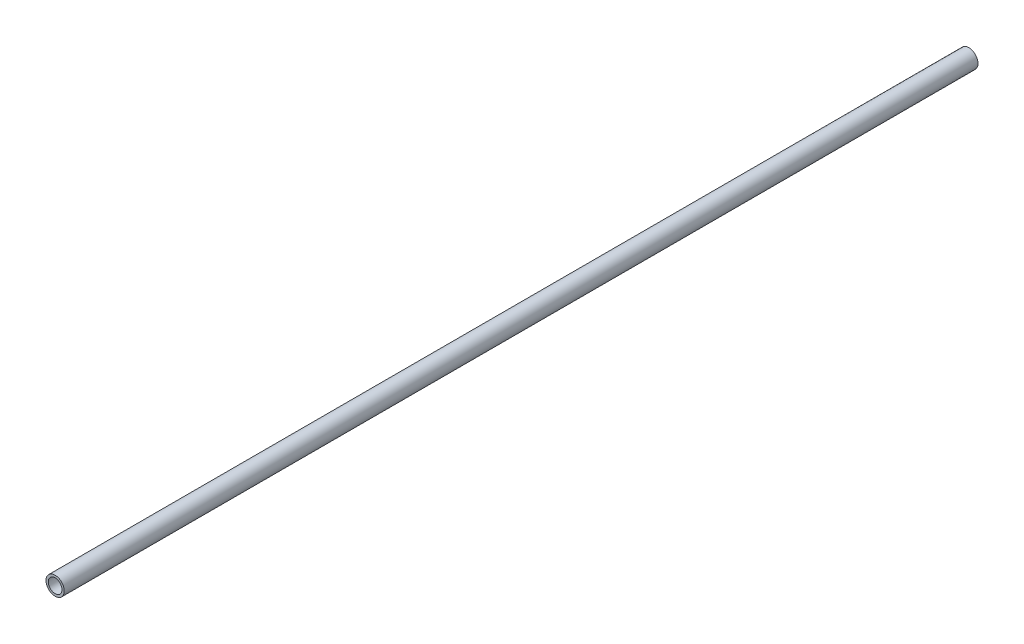
ISO-10303-21;
HEADER;
FILE_DESCRIPTION(('STEP AP214'),'2;1');
FILE_NAME('part.step','',(''),(''),'','','');
FILE_SCHEMA(('AUTOMOTIVE_DESIGN { 1 0 10303 214 1 1 1 1 }'));
ENDSEC;
DATA;
#1=APPLICATION_CONTEXT('core data for automotive mechanical design processes');
#2=APPLICATION_PROTOCOL_DEFINITION('international standard','automotive_design',2000,#1);
#3=PRODUCT_CONTEXT('',#1,'mechanical');
#4=PRODUCT('Part','Part','',(#3));
#5=PRODUCT_RELATED_PRODUCT_CATEGORY('part','',(#4));
#6=PRODUCT_DEFINITION_FORMATION('','',#4);
#7=PRODUCT_DEFINITION_CONTEXT('part definition',#1,'design');
#8=PRODUCT_DEFINITION('design','',#6,#7);
#9=PRODUCT_DEFINITION_SHAPE('','',#8);
#10=(LENGTH_UNIT() NAMED_UNIT(*) SI_UNIT(.MILLI.,.METRE.));
#11=(NAMED_UNIT(*) PLANE_ANGLE_UNIT() SI_UNIT($,.RADIAN.));
#12=(NAMED_UNIT(*) SI_UNIT($,.STERADIAN.) SOLID_ANGLE_UNIT());
#13=UNCERTAINTY_MEASURE_WITH_UNIT(LENGTH_MEASURE(1.E-05),#10,'distance_accuracy_value','');
#14=(GEOMETRIC_REPRESENTATION_CONTEXT(3) GLOBAL_UNCERTAINTY_ASSIGNED_CONTEXT((#13)) GLOBAL_UNIT_ASSIGNED_CONTEXT((#10,
#11,#12)) REPRESENTATION_CONTEXT('',''));
#15=CARTESIAN_POINT('',(0.,0.,0.));
#16=DIRECTION('',(0.,0.,1.));
#17=DIRECTION('',(1.,0.,0.));
#18=AXIS2_PLACEMENT_3D('',#15,#16,#17);
#19=CARTESIAN_POINT('',(0.,0.,400.));
#20=DIRECTION('',(0.,0.,1.));
#21=DIRECTION('',(1.,0.,0.));
#22=AXIS2_PLACEMENT_3D('',#19,#20,#21);
#23=PLANE('',#22);
#24=CARTESIAN_POINT('',(0.,0.,400.));
#25=DIRECTION('',(0.,0.,1.));
#26=DIRECTION('',(1.,0.,0.));
#27=AXIS2_PLACEMENT_3D('',#24,#25,#26);
#28=CIRCLE('',#27,4.);
#29=CARTESIAN_POINT('',(4.,0.,400.));
#30=VERTEX_POINT('',#29);
#31=EDGE_CURVE('E10',#30,#30,#28,.T.);
#32=ORIENTED_EDGE('',*,*,#31,.T.);
#33=EDGE_LOOP('',(#32));
#34=FACE_BOUND('',#33,.T.);
#35=CARTESIAN_POINT('',(0.,0.,400.));
#36=DIRECTION('',(0.,0.,1.));
#37=DIRECTION('',(1.,0.,0.));
#38=AXIS2_PLACEMENT_3D('',#35,#36,#37);
#39=CIRCLE('',#38,3.);
#40=CARTESIAN_POINT('',(3.,0.,400.));
#41=VERTEX_POINT('',#40);
#42=EDGE_CURVE('E46',#41,#41,#39,.T.);
#43=ORIENTED_EDGE('',*,*,#42,.F.);
#44=EDGE_LOOP('',(#43));
#45=FACE_BOUND('',#44,.T.);
#46=ADVANCED_FACE('F35',(#34,#45),#23,.T.);
#47=CARTESIAN_POINT('',(0.,0.,0.));
#48=DIRECTION('',(0.,0.,1.));
#49=DIRECTION('',(1.,0.,0.));
#50=AXIS2_PLACEMENT_3D('',#47,#48,#49);
#51=PLANE('',#50);
#52=CARTESIAN_POINT('',(0.,0.,0.));
#53=DIRECTION('',(0.,0.,1.));
#54=DIRECTION('',(1.,0.,0.));
#55=AXIS2_PLACEMENT_3D('',#52,#53,#54);
#56=CIRCLE('',#55,4.);
#57=CARTESIAN_POINT('',(4.,0.,0.));
#58=VERTEX_POINT('',#57);
#59=EDGE_CURVE('E39',#58,#58,#56,.T.);
#60=ORIENTED_EDGE('',*,*,#59,.F.);
#61=EDGE_LOOP('',(#60));
#62=FACE_BOUND('',#61,.T.);
#63=CARTESIAN_POINT('',(0.,0.,0.));
#64=DIRECTION('',(0.,0.,1.));
#65=DIRECTION('',(1.,0.,0.));
#66=AXIS2_PLACEMENT_3D('',#63,#64,#65);
#67=CIRCLE('',#66,3.);
#68=CARTESIAN_POINT('',(3.,0.,0.));
#69=VERTEX_POINT('',#68);
#70=EDGE_CURVE('E48',#69,#69,#67,.T.);
#71=ORIENTED_EDGE('',*,*,#70,.T.);
#72=EDGE_LOOP('',(#71));
#73=FACE_BOUND('',#72,.T.);
#74=ADVANCED_FACE('F58',(#62,#73),#51,.F.);
#75=CARTESIAN_POINT('',(0.,0.,400.));
#76=DIRECTION('',(0.,0.,-1.));
#77=DIRECTION('',(-1.,0.,0.));
#78=AXIS2_PLACEMENT_3D('',#75,#76,#77);
#79=CYLINDRICAL_SURFACE('',#78,4.);
#80=ORIENTED_EDGE('',*,*,#31,.F.);
#81=EDGE_LOOP('',(#80));
#82=FACE_BOUND('',#81,.T.);
#83=ORIENTED_EDGE('',*,*,#59,.T.);
#84=EDGE_LOOP('',(#83));
#85=FACE_BOUND('',#84,.T.);
#86=ADVANCED_FACE('F37',(#82,#85),#79,.T.);
#87=CARTESIAN_POINT('',(0.,0.,400.));
#88=DIRECTION('',(0.,0.,-1.));
#89=DIRECTION('',(-1.,0.,0.));
#90=AXIS2_PLACEMENT_3D('',#87,#88,#89);
#91=CYLINDRICAL_SURFACE('',#90,3.);
#92=ORIENTED_EDGE('',*,*,#42,.T.);
#93=EDGE_LOOP('',(#92));
#94=FACE_BOUND('',#93,.T.);
#95=ORIENTED_EDGE('',*,*,#70,.F.);
#96=EDGE_LOOP('',(#95));
#97=FACE_BOUND('',#96,.T.);
#98=ADVANCED_FACE('F54',(#94,#97),#91,.F.);
#99=CLOSED_SHELL('',(#46,#74,#86,#98));
#100=MANIFOLD_SOLID_BREP('B2',#99);
#101=ADVANCED_BREP_SHAPE_REPRESENTATION('',(#18,#100),#14);
#102=SHAPE_DEFINITION_REPRESENTATION(#9,#101);
ENDSEC;
END-ISO-10303-21;
